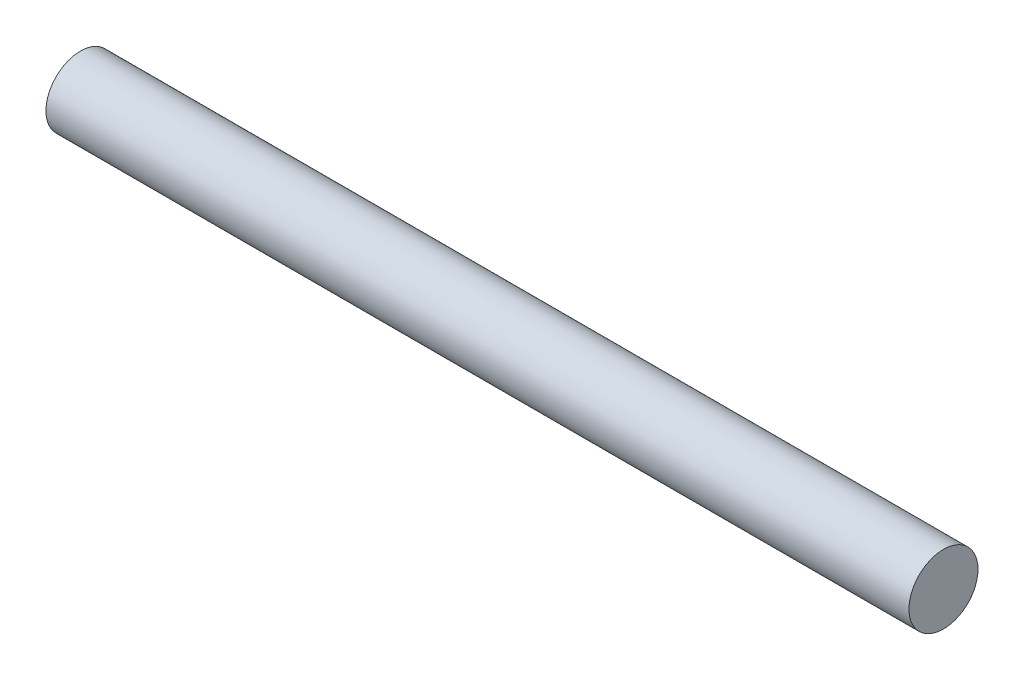
ISO-10303-21;
HEADER;
FILE_DESCRIPTION(('STEP AP214'),'2;1');
FILE_NAME('part.step','',(''),(''),'','','');
FILE_SCHEMA(('AUTOMOTIVE_DESIGN { 1 0 10303 214 1 1 1 1 }'));
ENDSEC;
DATA;
#1=APPLICATION_CONTEXT('core data for automotive mechanical design processes');
#2=APPLICATION_PROTOCOL_DEFINITION('international standard','automotive_design',2000,#1);
#3=PRODUCT_CONTEXT('',#1,'mechanical');
#4=PRODUCT('Part','Part','',(#3));
#5=PRODUCT_RELATED_PRODUCT_CATEGORY('part','',(#4));
#6=PRODUCT_DEFINITION_FORMATION('','',#4);
#7=PRODUCT_DEFINITION_CONTEXT('part definition',#1,'design');
#8=PRODUCT_DEFINITION('design','',#6,#7);
#9=PRODUCT_DEFINITION_SHAPE('','',#8);
#10=(LENGTH_UNIT() NAMED_UNIT(*) SI_UNIT(.MILLI.,.METRE.));
#11=(NAMED_UNIT(*) PLANE_ANGLE_UNIT() SI_UNIT($,.RADIAN.));
#12=(NAMED_UNIT(*) SI_UNIT($,.STERADIAN.) SOLID_ANGLE_UNIT());
#13=UNCERTAINTY_MEASURE_WITH_UNIT(LENGTH_MEASURE(1.E-05),#10,'distance_accuracy_value','');
#14=(GEOMETRIC_REPRESENTATION_CONTEXT(3) GLOBAL_UNCERTAINTY_ASSIGNED_CONTEXT((#13)) GLOBAL_UNIT_ASSIGNED_CONTEXT((#10,
#11,#12)) REPRESENTATION_CONTEXT('',''));
#15=CARTESIAN_POINT('',(0.,0.,0.));
#16=DIRECTION('',(0.,0.,1.));
#17=DIRECTION('',(1.,0.,0.));
#18=AXIS2_PLACEMENT_3D('',#15,#16,#17);
#19=CARTESIAN_POINT('',(20.,2.3656862745098,11.9049880763116));
#20=DIRECTION('',(-1.,0.,0.));
#21=DIRECTION('',(0.,0.,1.));
#22=AXIS2_PLACEMENT_3D('',#19,#20,#21);
#23=CYLINDRICAL_SURFACE('',#22,0.799999999999999);
#24=CARTESIAN_POINT('',(20.,2.3656862745098,11.9049880763116));
#25=DIRECTION('',(1.,0.,0.));
#26=DIRECTION('',(0.,0.,-1.));
#27=AXIS2_PLACEMENT_3D('',#24,#25,#26);
#28=CIRCLE('',#27,0.799999999999999);
#29=CARTESIAN_POINT('',(20.,2.3656862745098,11.1049880763116));
#30=VERTEX_POINT('',#29);
#31=EDGE_CURVE('E10',#30,#30,#28,.T.);
#32=ORIENTED_EDGE('',*,*,#31,.F.);
#33=EDGE_LOOP('',(#32));
#34=FACE_BOUND('',#33,.T.);
#35=CARTESIAN_POINT('',(0.,2.3656862745098,11.9049880763116));
#36=DIRECTION('',(1.,0.,0.));
#37=DIRECTION('',(0.,0.,-1.));
#38=AXIS2_PLACEMENT_3D('',#35,#36,#37);
#39=CIRCLE('',#38,0.799999999999999);
#40=CARTESIAN_POINT('',(0.,2.3656862745098,11.1049880763116));
#41=VERTEX_POINT('',#40);
#42=EDGE_CURVE('E34',#41,#41,#39,.T.);
#43=ORIENTED_EDGE('',*,*,#42,.T.);
#44=EDGE_LOOP('',(#43));
#45=FACE_BOUND('',#44,.T.);
#46=ADVANCED_FACE('F31',(#34,#45),#23,.T.);
#47=CARTESIAN_POINT('',(20.,2.3656862745098,11.9049880763116));
#48=DIRECTION('',(1.,0.,0.));
#49=DIRECTION('',(0.,0.,-1.));
#50=AXIS2_PLACEMENT_3D('',#47,#48,#49);
#51=PLANE('',#50);
#52=ORIENTED_EDGE('',*,*,#31,.T.);
#53=EDGE_LOOP('',(#52));
#54=FACE_BOUND('',#53,.T.);
#55=ADVANCED_FACE('F46',(#54),#51,.T.);
#56=CARTESIAN_POINT('',(0.,2.3656862745098,11.9049880763116));
#57=DIRECTION('',(1.,0.,0.));
#58=DIRECTION('',(0.,0.,-1.));
#59=AXIS2_PLACEMENT_3D('',#56,#57,#58);
#60=PLANE('',#59);
#61=ORIENTED_EDGE('',*,*,#42,.F.);
#62=EDGE_LOOP('',(#61));
#63=FACE_BOUND('',#62,.T.);
#64=ADVANCED_FACE('F44',(#63),#60,.F.);
#65=CLOSED_SHELL('',(#46,#55,#64));
#66=MANIFOLD_SOLID_BREP('B2',#65);
#67=ADVANCED_BREP_SHAPE_REPRESENTATION('',(#18,#66),#14);
#68=SHAPE_DEFINITION_REPRESENTATION(#9,#67);
ENDSEC;
END-ISO-10303-21;
